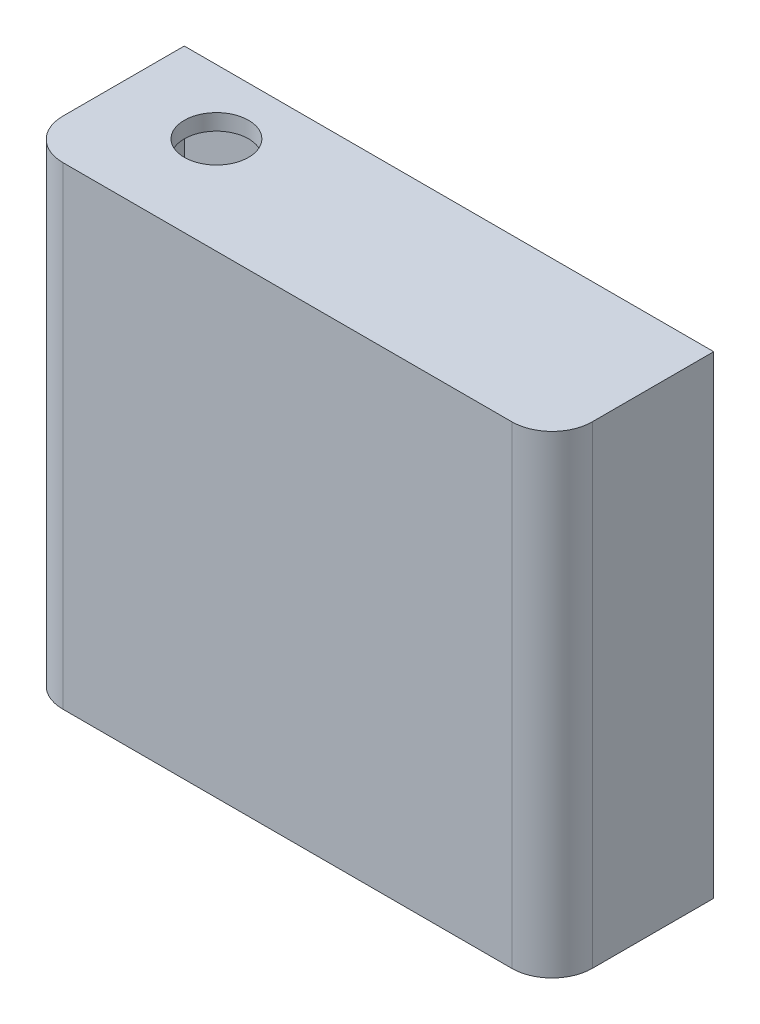
ISO-10303-21;
HEADER;
FILE_DESCRIPTION(('STEP AP214'),'2;1');
FILE_NAME('part.step','',(''),(''),'','','');
FILE_SCHEMA(('AUTOMOTIVE_DESIGN { 1 0 10303 214 1 1 1 1 }'));
ENDSEC;
DATA;
#1=APPLICATION_CONTEXT('core data for automotive mechanical design processes');
#2=APPLICATION_PROTOCOL_DEFINITION('international standard','automotive_design',2000,#1);
#3=PRODUCT_CONTEXT('',#1,'mechanical');
#4=PRODUCT('Part','Part','',(#3));
#5=PRODUCT_RELATED_PRODUCT_CATEGORY('part','',(#4));
#6=PRODUCT_DEFINITION_FORMATION('','',#4);
#7=PRODUCT_DEFINITION_CONTEXT('part definition',#1,'design');
#8=PRODUCT_DEFINITION('design','',#6,#7);
#9=PRODUCT_DEFINITION_SHAPE('','',#8);
#10=(LENGTH_UNIT() NAMED_UNIT(*) SI_UNIT(.MILLI.,.METRE.));
#11=(NAMED_UNIT(*) PLANE_ANGLE_UNIT() SI_UNIT($,.RADIAN.));
#12=(NAMED_UNIT(*) SI_UNIT($,.STERADIAN.) SOLID_ANGLE_UNIT());
#13=UNCERTAINTY_MEASURE_WITH_UNIT(LENGTH_MEASURE(1.E-05),#10,'distance_accuracy_value','');
#14=(GEOMETRIC_REPRESENTATION_CONTEXT(3) GLOBAL_UNCERTAINTY_ASSIGNED_CONTEXT((#13)) GLOBAL_UNIT_ASSIGNED_CONTEXT((#10,
#11,#12)) REPRESENTATION_CONTEXT('',''));
#15=CARTESIAN_POINT('',(0.,0.,0.));
#16=DIRECTION('',(0.,0.,1.));
#17=DIRECTION('',(1.,0.,0.));
#18=AXIS2_PLACEMENT_3D('',#15,#16,#17);
#19=CARTESIAN_POINT('',(0.,0.,-15.113));
#20=DIRECTION('',(0.,0.,-1.));
#21=DIRECTION('',(0.,1.,0.));
#22=AXIS2_PLACEMENT_3D('',#19,#20,#21);
#23=PLANE('',#22);
#24=DIRECTION('',(1.,0.,0.));
#25=VECTOR('',#24,1.);
#26=CARTESIAN_POINT('',(20.084,40.396,-15.113));
#27=LINE('',#26,#25);
#28=CARTESIAN_POINT('',(1.80000000000003,40.396,-15.113));
#29=VERTEX_POINT('',#28);
#30=CARTESIAN_POINT('',(24.084,40.396,-15.113));
#31=VERTEX_POINT('',#30);
#32=EDGE_CURVE('E238',#29,#31,#27,.T.);
#33=ORIENTED_EDGE('',*,*,#32,.T.);
#34=DIRECTION('',(0.,-1.,0.));
#35=VECTOR('',#34,1.);
#36=CARTESIAN_POINT('',(24.084,40.396,-15.113));
#37=LINE('',#36,#35);
#38=CARTESIAN_POINT('',(24.084,28.396,-15.113));
#39=VERTEX_POINT('',#38);
#40=EDGE_CURVE('E222',#31,#39,#37,.T.);
#41=ORIENTED_EDGE('',*,*,#40,.T.);
#42=DIRECTION('',(-1.,0.,0.));
#43=VECTOR('',#42,1.);
#44=CARTESIAN_POINT('',(20.084,28.396,-15.113));
#45=LINE('',#44,#43);
#46=CARTESIAN_POINT('',(1.80000000000003,28.396,-15.113));
#47=VERTEX_POINT('',#46);
#48=EDGE_CURVE('E230',#39,#47,#45,.T.);
#49=ORIENTED_EDGE('',*,*,#48,.T.);
#50=DIRECTION('',(0.,1.,0.));
#51=VECTOR('',#50,1.);
#52=CARTESIAN_POINT('',(1.80000000000003,40.396,-15.113));
#53=LINE('',#52,#51);
#54=EDGE_CURVE('E234',#47,#29,#53,.T.);
#55=ORIENTED_EDGE('',*,*,#54,.T.);
#56=EDGE_LOOP('',(#33,#41,#49,#55));
#57=FACE_BOUND('',#56,.T.);
#58=DIRECTION('',(0.,-1.,0.));
#59=VECTOR('',#58,1.);
#60=CARTESIAN_POINT('',(61.668,56.896,-15.113));
#61=LINE('',#60,#59);
#62=CARTESIAN_POINT('',(61.668,56.896,-15.113));
#63=VERTEX_POINT('',#62);
#64=CARTESIAN_POINT('',(61.668,0.,-15.113));
#65=VERTEX_POINT('',#64);
#66=EDGE_CURVE('E203',#63,#65,#61,.T.);
#67=ORIENTED_EDGE('',*,*,#66,.F.);
#68=DIRECTION('',(1.,0.,0.));
#69=VECTOR('',#68,1.);
#70=CARTESIAN_POINT('',(63.668,56.896,-15.113));
#71=LINE('',#70,#69);
#72=CARTESIAN_POINT('',(-0.199999999999965,56.896,-15.113));
#73=VERTEX_POINT('',#72);
#74=EDGE_CURVE('E274',#73,#63,#71,.T.);
#75=ORIENTED_EDGE('',*,*,#74,.F.);
#76=DIRECTION('',(0.,1.,0.));
#77=VECTOR('',#76,1.);
#78=CARTESIAN_POINT('',(-0.199999999999965,56.896,-15.113));
#79=LINE('',#78,#77);
#80=CARTESIAN_POINT('',(-0.199999999999964,0.,-15.113));
#81=VERTEX_POINT('',#80);
#82=EDGE_CURVE('E213',#81,#73,#79,.T.);
#83=ORIENTED_EDGE('',*,*,#82,.F.);
#84=DIRECTION('',(-1.,0.,0.));
#85=VECTOR('',#84,1.);
#86=CARTESIAN_POINT('',(63.668,0.,-15.113));
#87=LINE('',#86,#85);
#88=EDGE_CURVE('E270',#65,#81,#87,.T.);
#89=ORIENTED_EDGE('',*,*,#88,.F.);
#90=EDGE_LOOP('',(#67,#75,#83,#89));
#91=FACE_BOUND('',#90,.T.);
#92=ADVANCED_FACE('F39',(#57,#91),#23,.F.);
#93=CARTESIAN_POINT('',(63.668,56.896,-17.113));
#94=DIRECTION('',(-1.,0.,0.));
#95=DIRECTION('',(0.,-1.,0.));
#96=AXIS2_PLACEMENT_3D('',#93,#94,#95);
#97=PLANE('',#96);
#98=DIRECTION('',(0.,0.,-1.));
#99=VECTOR('',#98,1.);
#100=CARTESIAN_POINT('',(63.668,58.896,3.));
#101=LINE('',#100,#99);
#102=CARTESIAN_POINT('',(63.668,58.896,-2.));
#103=VERTEX_POINT('',#102);
#104=CARTESIAN_POINT('',(63.668,58.896,-17.113));
#105=VERTEX_POINT('',#104);
#106=EDGE_CURVE('E181',#103,#105,#101,.T.);
#107=ORIENTED_EDGE('',*,*,#106,.F.);
#108=DIRECTION('',(0.,1.,0.));
#109=VECTOR('',#108,1.);
#110=CARTESIAN_POINT('',(63.668,0.,-2.));
#111=LINE('',#110,#109);
#112=CARTESIAN_POINT('',(63.668,0.,-2.));
#113=VERTEX_POINT('',#112);
#114=EDGE_CURVE('E311',#103,#113,#111,.F.);
#115=ORIENTED_EDGE('',*,*,#114,.T.);
#116=DIRECTION('',(0.,0.,1.));
#117=VECTOR('',#116,1.);
#118=CARTESIAN_POINT('',(63.668,0.,-17.113));
#119=LINE('',#118,#117);
#120=CARTESIAN_POINT('',(63.668,0.,-17.113));
#121=VERTEX_POINT('',#120);
#122=EDGE_CURVE('E285',#121,#113,#119,.T.);
#123=ORIENTED_EDGE('',*,*,#122,.F.);
#124=DIRECTION('',(0.,-1.,0.));
#125=VECTOR('',#124,1.);
#126=CARTESIAN_POINT('',(63.668,56.896,-17.113));
#127=LINE('',#126,#125);
#128=EDGE_CURVE('E271',#105,#121,#127,.T.);
#129=ORIENTED_EDGE('',*,*,#128,.F.);
#130=EDGE_LOOP('',(#107,#115,#123,#129));
#131=FACE_BOUND('',#130,.T.);
#132=ADVANCED_FACE('F366',(#131),#97,.F.);
#133=CARTESIAN_POINT('',(63.668,0.,-17.113));
#134=DIRECTION('',(0.,1.,0.));
#135=DIRECTION('',(-1.,0.,0.));
#136=AXIS2_PLACEMENT_3D('',#133,#134,#135);
#137=PLANE('',#136);
#138=DIRECTION('',(0.,0.,-1.));
#139=VECTOR('',#138,1.);
#140=CARTESIAN_POINT('',(-0.199999999999958,0.,62.9311410038478));
#141=LINE('',#140,#139);
#142=CARTESIAN_POINT('',(-0.199999999999958,0.,-4.));
#143=VERTEX_POINT('',#142);
#144=EDGE_CURVE('E218',#143,#81,#141,.T.);
#145=ORIENTED_EDGE('',*,*,#144,.F.);
#146=CARTESIAN_POINT('',(4.80000000000004,0.,-4.));
#147=DIRECTION('',(0.,1.,0.));
#148=DIRECTION('',(-1.,0.,0.));
#149=AXIS2_PLACEMENT_3D('',#146,#147,#148);
#150=CIRCLE('',#149,5.);
#151=CARTESIAN_POINT('',(4.80000000000004,0.,0.999999999999999));
#152=VERTEX_POINT('',#151);
#153=EDGE_CURVE('E49',#143,#152,#150,.T.);
#154=ORIENTED_EDGE('',*,*,#153,.T.);
#155=DIRECTION('',(1.,0.,0.));
#156=VECTOR('',#155,1.);
#157=CARTESIAN_POINT('',(-2.19999999999997,0.,0.999999999999999));
#158=LINE('',#157,#156);
#159=CARTESIAN_POINT('',(56.668,0.,0.999999999999999));
#160=VERTEX_POINT('',#159);
#161=EDGE_CURVE('E195',#152,#160,#158,.T.);
#162=ORIENTED_EDGE('',*,*,#161,.T.);
#163=CARTESIAN_POINT('',(56.668,0.,-4.));
#164=DIRECTION('',(0.,1.,0.));
#165=DIRECTION('',(-1.,0.,0.));
#166=AXIS2_PLACEMENT_3D('',#163,#164,#165);
#167=CIRCLE('',#166,5.);
#168=CARTESIAN_POINT('',(61.668,0.,-4.));
#169=VERTEX_POINT('',#168);
#170=EDGE_CURVE('E11',#160,#169,#167,.T.);
#171=ORIENTED_EDGE('',*,*,#170,.T.);
#172=DIRECTION('',(0.,0.,-1.));
#173=VECTOR('',#172,1.);
#174=CARTESIAN_POINT('',(61.668,0.,62.9311410038478));
#175=LINE('',#174,#173);
#176=EDGE_CURVE('E207',#169,#65,#175,.T.);
#177=ORIENTED_EDGE('',*,*,#176,.T.);
#178=ORIENTED_EDGE('',*,*,#88,.T.);
#179=EDGE_LOOP('',(#145,#154,#162,#171,#177,#178));
#180=FACE_BOUND('',#179,.T.);
#181=DIRECTION('',(1.,0.,0.));
#182=VECTOR('',#181,1.);
#183=CARTESIAN_POINT('',(-2.19999999999996,0.,3.));
#184=LINE('',#183,#182);
#185=CARTESIAN_POINT('',(2.80000000000003,0.,3.));
#186=VERTEX_POINT('',#185);
#187=CARTESIAN_POINT('',(58.668,-2.94062861023119E-13,3.));
#188=VERTEX_POINT('',#187);
#189=EDGE_CURVE('E217',#186,#188,#184,.T.);
#190=ORIENTED_EDGE('',*,*,#189,.F.);
#191=CARTESIAN_POINT('',(2.80000000000003,0.,-2.));
#192=DIRECTION('',(0.,1.,0.));
#193=DIRECTION('',(-1.,0.,0.));
#194=AXIS2_PLACEMENT_3D('',#191,#192,#193);
#195=CIRCLE('',#194,5.);
#196=CARTESIAN_POINT('',(-2.19999999999997,0.,-2.));
#197=VERTEX_POINT('',#196);
#198=EDGE_CURVE('E300',#186,#197,#195,.F.);
#199=ORIENTED_EDGE('',*,*,#198,.T.);
#200=DIRECTION('',(0.,0.,1.));
#201=VECTOR('',#200,1.);
#202=CARTESIAN_POINT('',(-2.19999999999997,0.,-17.113));
#203=LINE('',#202,#201);
#204=CARTESIAN_POINT('',(-2.19999999999997,0.,-17.113));
#205=VERTEX_POINT('',#204);
#206=EDGE_CURVE('E167',#205,#197,#203,.T.);
#207=ORIENTED_EDGE('',*,*,#206,.F.);
#208=DIRECTION('',(-1.,0.,0.));
#209=VECTOR('',#208,1.);
#210=CARTESIAN_POINT('',(63.668,0.,-17.113));
#211=LINE('',#210,#209);
#212=EDGE_CURVE('E162',#121,#205,#211,.T.);
#213=ORIENTED_EDGE('',*,*,#212,.F.);
#214=ORIENTED_EDGE('',*,*,#122,.T.);
#215=CARTESIAN_POINT('',(58.668,0.,-2.));
#216=DIRECTION('',(0.,1.,0.));
#217=DIRECTION('',(-1.,0.,0.));
#218=AXIS2_PLACEMENT_3D('',#215,#216,#217);
#219=CIRCLE('',#218,5.);
#220=EDGE_CURVE('E297',#113,#188,#219,.F.);
#221=ORIENTED_EDGE('',*,*,#220,.T.);
#222=EDGE_LOOP('',(#190,#199,#207,#213,#214,#221));
#223=FACE_BOUND('',#222,.T.);
#224=ADVANCED_FACE('F334',(#180,#223),#137,.F.);
#225=CARTESIAN_POINT('',(-2.19999999999997,56.896,-17.113));
#226=DIRECTION('',(1.,0.,0.));
#227=DIRECTION('',(0.,0.,-1.));
#228=AXIS2_PLACEMENT_3D('',#225,#226,#227);
#229=PLANE('',#228);
#230=ORIENTED_EDGE('',*,*,#206,.T.);
#231=DIRECTION('',(0.,-1.,0.));
#232=VECTOR('',#231,1.);
#233=CARTESIAN_POINT('',(-2.19999999999997,58.896,-2.));
#234=LINE('',#233,#232);
#235=CARTESIAN_POINT('',(-2.19999999999997,58.896,-2.));
#236=VERTEX_POINT('',#235);
#237=EDGE_CURVE('E173',#197,#236,#234,.F.);
#238=ORIENTED_EDGE('',*,*,#237,.T.);
#239=DIRECTION('',(0.,0.,1.));
#240=VECTOR('',#239,1.);
#241=CARTESIAN_POINT('',(-2.19999999999997,58.896,-17.113));
#242=LINE('',#241,#240);
#243=CARTESIAN_POINT('',(-2.19999999999997,58.896,-17.113));
#244=VERTEX_POINT('',#243);
#245=EDGE_CURVE('E170',#244,#236,#242,.T.);
#246=ORIENTED_EDGE('',*,*,#245,.F.);
#247=DIRECTION('',(0.,1.,0.));
#248=VECTOR('',#247,1.);
#249=CARTESIAN_POINT('',(-2.19999999999997,56.896,-17.113));
#250=LINE('',#249,#248);
#251=EDGE_CURVE('E156',#205,#244,#250,.T.);
#252=ORIENTED_EDGE('',*,*,#251,.F.);
#253=EDGE_LOOP('',(#230,#238,#246,#252));
#254=FACE_BOUND('',#253,.T.);
#255=ADVANCED_FACE('F171',(#254),#229,.F.);
#256=CARTESIAN_POINT('',(0.,0.,-17.113));
#257=DIRECTION('',(0.,0.,-1.));
#258=DIRECTION('',(0.,1.,0.));
#259=AXIS2_PLACEMENT_3D('',#256,#257,#258);
#260=PLANE('',#259);
#261=DIRECTION('',(0.,-1.,0.));
#262=VECTOR('',#261,1.);
#263=CARTESIAN_POINT('',(24.084,0.,-17.113));
#264=LINE('',#263,#262);
#265=CARTESIAN_POINT('',(24.084,40.396,-17.113));
#266=VERTEX_POINT('',#265);
#267=CARTESIAN_POINT('',(24.084,28.396,-17.113));
#268=VERTEX_POINT('',#267);
#269=EDGE_CURVE('E266',#266,#268,#264,.T.);
#270=ORIENTED_EDGE('',*,*,#269,.F.);
#271=DIRECTION('',(1.,0.,0.));
#272=VECTOR('',#271,1.);
#273=CARTESIAN_POINT('',(0.,40.396,-17.113));
#274=LINE('',#273,#272);
#275=CARTESIAN_POINT('',(1.80000000000003,40.396,-17.113));
#276=VERTEX_POINT('',#275);
#277=EDGE_CURVE('E263',#276,#266,#274,.T.);
#278=ORIENTED_EDGE('',*,*,#277,.F.);
#279=DIRECTION('',(0.,1.,0.));
#280=VECTOR('',#279,1.);
#281=CARTESIAN_POINT('',(1.80000000000003,0.,-17.113));
#282=LINE('',#281,#280);
#283=CARTESIAN_POINT('',(1.80000000000003,28.396,-17.113));
#284=VERTEX_POINT('',#283);
#285=EDGE_CURVE('E260',#284,#276,#282,.T.);
#286=ORIENTED_EDGE('',*,*,#285,.F.);
#287=DIRECTION('',(-1.,0.,0.));
#288=VECTOR('',#287,1.);
#289=CARTESIAN_POINT('',(0.,28.396,-17.113));
#290=LINE('',#289,#288);
#291=EDGE_CURVE('E247',#268,#284,#290,.T.);
#292=ORIENTED_EDGE('',*,*,#291,.F.);
#293=EDGE_LOOP('',(#270,#278,#286,#292));
#294=FACE_BOUND('',#293,.T.);
#295=ORIENTED_EDGE('',*,*,#128,.T.);
#296=ORIENTED_EDGE('',*,*,#212,.T.);
#297=ORIENTED_EDGE('',*,*,#251,.T.);
#298=DIRECTION('',(-1.,0.,0.));
#299=VECTOR('',#298,1.);
#300=CARTESIAN_POINT('',(63.668,58.896,-17.113));
#301=LINE('',#300,#299);
#302=EDGE_CURVE('E161',#105,#244,#301,.T.);
#303=ORIENTED_EDGE('',*,*,#302,.F.);
#304=EDGE_LOOP('',(#295,#296,#297,#303));
#305=FACE_BOUND('',#304,.T.);
#306=ADVANCED_FACE('F159',(#294,#305),#260,.T.);
#307=CARTESIAN_POINT('',(24.084,40.396,-15.113));
#308=DIRECTION('',(1.,0.,0.));
#309=DIRECTION('',(0.,0.,-1.));
#310=AXIS2_PLACEMENT_3D('',#307,#308,#309);
#311=PLANE('',#310);
#312=ORIENTED_EDGE('',*,*,#269,.T.);
#313=DIRECTION('',(0.,0.,-1.));
#314=VECTOR('',#313,1.);
#315=CARTESIAN_POINT('',(24.084,28.396,-15.113));
#316=LINE('',#315,#314);
#317=EDGE_CURVE('E242',#39,#268,#316,.T.);
#318=ORIENTED_EDGE('',*,*,#317,.F.);
#319=ORIENTED_EDGE('',*,*,#40,.F.);
#320=DIRECTION('',(0.,0.,-1.));
#321=VECTOR('',#320,1.);
#322=CARTESIAN_POINT('',(24.084,40.396,-15.113));
#323=LINE('',#322,#321);
#324=EDGE_CURVE('E243',#31,#266,#323,.T.);
#325=ORIENTED_EDGE('',*,*,#324,.T.);
#326=EDGE_LOOP('',(#312,#318,#319,#325));
#327=FACE_BOUND('',#326,.T.);
#328=ADVANCED_FACE('F416',(#327),#311,.F.);
#329=CARTESIAN_POINT('',(20.084,40.396,-15.113));
#330=DIRECTION('',(0.,1.,0.));
#331=DIRECTION('',(0.,0.,1.));
#332=AXIS2_PLACEMENT_3D('',#329,#330,#331);
#333=PLANE('',#332);
#334=ORIENTED_EDGE('',*,*,#277,.T.);
#335=ORIENTED_EDGE('',*,*,#324,.F.);
#336=ORIENTED_EDGE('',*,*,#32,.F.);
#337=DIRECTION('',(0.,0.,-1.));
#338=VECTOR('',#337,1.);
#339=CARTESIAN_POINT('',(1.80000000000003,40.396,-15.113));
#340=LINE('',#339,#338);
#341=EDGE_CURVE('E248',#29,#276,#340,.T.);
#342=ORIENTED_EDGE('',*,*,#341,.T.);
#343=EDGE_LOOP('',(#334,#335,#336,#342));
#344=FACE_BOUND('',#343,.T.);
#345=ADVANCED_FACE('F412',(#344),#333,.F.);
#346=CARTESIAN_POINT('',(1.80000000000003,40.396,-15.113));
#347=DIRECTION('',(-1.,0.,0.));
#348=DIRECTION('',(0.,-1.,0.));
#349=AXIS2_PLACEMENT_3D('',#346,#347,#348);
#350=PLANE('',#349);
#351=ORIENTED_EDGE('',*,*,#285,.T.);
#352=ORIENTED_EDGE('',*,*,#341,.F.);
#353=ORIENTED_EDGE('',*,*,#54,.F.);
#354=DIRECTION('',(0.,0.,-1.));
#355=VECTOR('',#354,1.);
#356=CARTESIAN_POINT('',(1.80000000000003,28.396,-15.113));
#357=LINE('',#356,#355);
#358=EDGE_CURVE('E252',#47,#284,#357,.T.);
#359=ORIENTED_EDGE('',*,*,#358,.T.);
#360=EDGE_LOOP('',(#351,#352,#353,#359));
#361=FACE_BOUND('',#360,.T.);
#362=ADVANCED_FACE('F415',(#361),#350,.F.);
#363=CARTESIAN_POINT('',(1.80000000000003,28.396,-15.113));
#364=DIRECTION('',(0.,-1.,0.));
#365=DIRECTION('',(0.,0.,-1.));
#366=AXIS2_PLACEMENT_3D('',#363,#364,#365);
#367=PLANE('',#366);
#368=ORIENTED_EDGE('',*,*,#291,.T.);
#369=ORIENTED_EDGE('',*,*,#358,.F.);
#370=ORIENTED_EDGE('',*,*,#48,.F.);
#371=ORIENTED_EDGE('',*,*,#317,.T.);
#372=EDGE_LOOP('',(#368,#369,#370,#371));
#373=FACE_BOUND('',#372,.T.);
#374=ADVANCED_FACE('F409',(#373),#367,.F.);
#375=CARTESIAN_POINT('',(-0.199999999999965,56.896,62.9311410038478));
#376=DIRECTION('',(-1.,0.,0.));
#377=DIRECTION('',(0.,-1.,0.));
#378=AXIS2_PLACEMENT_3D('',#375,#376,#377);
#379=PLANE('',#378);
#380=DIRECTION('',(0.,0.,-1.));
#381=VECTOR('',#380,1.);
#382=CARTESIAN_POINT('',(-0.199999999999965,56.896,62.9311410038478));
#383=LINE('',#382,#381);
#384=CARTESIAN_POINT('',(-0.199999999999965,56.896,-4.));
#385=VERTEX_POINT('',#384);
#386=EDGE_CURVE('E212',#385,#73,#383,.T.);
#387=ORIENTED_EDGE('',*,*,#386,.F.);
#388=DIRECTION('',(0.,-1.,0.));
#389=VECTOR('',#388,1.);
#390=CARTESIAN_POINT('',(-0.199999999999965,56.896,-4.));
#391=LINE('',#390,#389);
#392=EDGE_CURVE('E314',#385,#143,#391,.T.);
#393=ORIENTED_EDGE('',*,*,#392,.T.);
#394=ORIENTED_EDGE('',*,*,#144,.T.);
#395=ORIENTED_EDGE('',*,*,#82,.T.);
#396=EDGE_LOOP('',(#387,#393,#394,#395));
#397=FACE_BOUND('',#396,.T.);
#398=ADVANCED_FACE('F347',(#397),#379,.F.);
#399=CARTESIAN_POINT('',(0.,56.896,3.));
#400=DIRECTION('',(0.,0.,1.));
#401=DIRECTION('',(0.,-1.,0.));
#402=AXIS2_PLACEMENT_3D('',#399,#400,#401);
#403=PLANE('',#402);
#404=DIRECTION('',(1.,0.,0.));
#405=VECTOR('',#404,1.);
#406=CARTESIAN_POINT('',(-2.19999999999997,58.896,3.));
#407=LINE('',#406,#405);
#408=CARTESIAN_POINT('',(2.80000000000003,58.896,3.));
#409=VERTEX_POINT('',#408);
#410=CARTESIAN_POINT('',(58.668,58.896,3.));
#411=VERTEX_POINT('',#410);
#412=EDGE_CURVE('E177',#409,#411,#407,.T.);
#413=ORIENTED_EDGE('',*,*,#412,.F.);
#414=DIRECTION('',(0.,-1.,0.));
#415=VECTOR('',#414,1.);
#416=CARTESIAN_POINT('',(2.80000000000003,0.,3.));
#417=LINE('',#416,#415);
#418=EDGE_CURVE('E293',#409,#186,#417,.T.);
#419=ORIENTED_EDGE('',*,*,#418,.T.);
#420=ORIENTED_EDGE('',*,*,#189,.T.);
#421=DIRECTION('',(0.,1.,0.));
#422=VECTOR('',#421,1.);
#423=CARTESIAN_POINT('',(58.668,58.896,3.));
#424=LINE('',#423,#422);
#425=EDGE_CURVE('E289',#188,#411,#424,.T.);
#426=ORIENTED_EDGE('',*,*,#425,.T.);
#427=EDGE_LOOP('',(#413,#419,#420,#426));
#428=FACE_BOUND('',#427,.T.);
#429=ADVANCED_FACE('F398',(#428),#403,.T.);
#430=CARTESIAN_POINT('',(61.668,56.896,62.9311410038478));
#431=DIRECTION('',(1.,0.,0.));
#432=DIRECTION('',(0.,1.,0.));
#433=AXIS2_PLACEMENT_3D('',#430,#431,#432);
#434=PLANE('',#433);
#435=ORIENTED_EDGE('',*,*,#176,.F.);
#436=DIRECTION('',(0.,1.,0.));
#437=VECTOR('',#436,1.);
#438=CARTESIAN_POINT('',(61.668,56.896,-4.));
#439=LINE('',#438,#437);
#440=CARTESIAN_POINT('',(61.668,56.896,-4.));
#441=VERTEX_POINT('',#440);
#442=EDGE_CURVE('E328',#169,#441,#439,.T.);
#443=ORIENTED_EDGE('',*,*,#442,.T.);
#444=DIRECTION('',(0.,0.,-1.));
#445=VECTOR('',#444,1.);
#446=CARTESIAN_POINT('',(61.668,56.896,62.9311410038478));
#447=LINE('',#446,#445);
#448=EDGE_CURVE('E202',#441,#63,#447,.T.);
#449=ORIENTED_EDGE('',*,*,#448,.T.);
#450=ORIENTED_EDGE('',*,*,#66,.T.);
#451=EDGE_LOOP('',(#435,#443,#449,#450));
#452=FACE_BOUND('',#451,.T.);
#453=ADVANCED_FACE('F355',(#452),#434,.F.);
#454=CARTESIAN_POINT('',(0.,0.,0.999999999999999));
#455=DIRECTION('',(0.,0.,-1.));
#456=DIRECTION('',(-1.,0.,0.));
#457=AXIS2_PLACEMENT_3D('',#454,#455,#456);
#458=PLANE('',#457);
#459=ORIENTED_EDGE('',*,*,#161,.F.);
#460=DIRECTION('',(0.,-1.,0.));
#461=VECTOR('',#460,1.);
#462=CARTESIAN_POINT('',(4.80000000000004,0.,0.999999999999999));
#463=LINE('',#462,#461);
#464=CARTESIAN_POINT('',(4.80000000000003,56.896,0.999999999999999));
#465=VERTEX_POINT('',#464);
#466=EDGE_CURVE('E64',#152,#465,#463,.F.);
#467=ORIENTED_EDGE('',*,*,#466,.T.);
#468=DIRECTION('',(-1.,0.,0.));
#469=VECTOR('',#468,1.);
#470=CARTESIAN_POINT('',(-2.19999999999997,56.896,0.999999999999999));
#471=LINE('',#470,#469);
#472=CARTESIAN_POINT('',(56.668,56.896,0.999999999999999));
#473=VERTEX_POINT('',#472);
#474=EDGE_CURVE('E199',#473,#465,#471,.T.);
#475=ORIENTED_EDGE('',*,*,#474,.F.);
#476=DIRECTION('',(0.,1.,0.));
#477=VECTOR('',#476,1.);
#478=CARTESIAN_POINT('',(56.668,0.,0.999999999999999));
#479=LINE('',#478,#477);
#480=EDGE_CURVE('E318',#473,#160,#479,.F.);
#481=ORIENTED_EDGE('',*,*,#480,.T.);
#482=EDGE_LOOP('',(#459,#467,#475,#481));
#483=FACE_BOUND('',#482,.T.);
#484=ADVANCED_FACE('F339',(#483),#458,.T.);
#485=CARTESIAN_POINT('',(0.,56.896,0.));
#486=DIRECTION('',(0.,1.,0.));
#487=DIRECTION('',(-1.,0.,0.));
#488=AXIS2_PLACEMENT_3D('',#485,#486,#487);
#489=PLANE('',#488);
#490=CARTESIAN_POINT('',(9.80000000000003,56.896,-9.113));
#491=DIRECTION('',(0.,1.,0.));
#492=DIRECTION('',(-1.,0.,0.));
#493=AXIS2_PLACEMENT_3D('',#490,#491,#492);
#494=CIRCLE('',#493,4.);
#495=CARTESIAN_POINT('',(5.80000000000003,56.896,-9.113));
#496=VERTEX_POINT('',#495);
#497=EDGE_CURVE('E184',#496,#496,#494,.T.);
#498=ORIENTED_EDGE('',*,*,#497,.T.);
#499=EDGE_LOOP('',(#498));
#500=FACE_BOUND('',#499,.T.);
#501=ORIENTED_EDGE('',*,*,#474,.T.);
#502=CARTESIAN_POINT('',(4.80000000000003,56.896,-4.));
#503=DIRECTION('',(0.,1.,0.));
#504=DIRECTION('',(-1.,0.,0.));
#505=AXIS2_PLACEMENT_3D('',#502,#503,#504);
#506=CIRCLE('',#505,5.);
#507=EDGE_CURVE('E325',#465,#385,#506,.F.);
#508=ORIENTED_EDGE('',*,*,#507,.T.);
#509=ORIENTED_EDGE('',*,*,#386,.T.);
#510=ORIENTED_EDGE('',*,*,#74,.T.);
#511=ORIENTED_EDGE('',*,*,#448,.F.);
#512=CARTESIAN_POINT('',(56.668,56.896,-4.));
#513=DIRECTION('',(0.,1.,0.));
#514=DIRECTION('',(-1.,0.,0.));
#515=AXIS2_PLACEMENT_3D('',#512,#513,#514);
#516=CIRCLE('',#515,5.);
#517=EDGE_CURVE('E56',#441,#473,#516,.F.);
#518=ORIENTED_EDGE('',*,*,#517,.T.);
#519=EDGE_LOOP('',(#501,#508,#509,#510,#511,#518));
#520=FACE_BOUND('',#519,.T.);
#521=ADVANCED_FACE('F344',(#500,#520),#489,.F.);
#522=CARTESIAN_POINT('',(0.,58.896,0.));
#523=DIRECTION('',(0.,1.,0.));
#524=DIRECTION('',(-1.,0.,0.));
#525=AXIS2_PLACEMENT_3D('',#522,#523,#524);
#526=PLANE('',#525);
#527=CARTESIAN_POINT('',(9.80000000000003,58.896,-9.113));
#528=DIRECTION('',(0.,1.,0.));
#529=DIRECTION('',(-1.,0.,0.));
#530=AXIS2_PLACEMENT_3D('',#527,#528,#529);
#531=CIRCLE('',#530,4.);
#532=CARTESIAN_POINT('',(5.80000000000003,58.896,-9.113));
#533=VERTEX_POINT('',#532);
#534=EDGE_CURVE('E43',#533,#533,#531,.T.);
#535=ORIENTED_EDGE('',*,*,#534,.F.);
#536=EDGE_LOOP('',(#535));
#537=FACE_BOUND('',#536,.T.);
#538=ORIENTED_EDGE('',*,*,#245,.T.);
#539=CARTESIAN_POINT('',(2.80000000000003,58.896,-2.));
#540=DIRECTION('',(0.,1.,0.));
#541=DIRECTION('',(-1.,0.,0.));
#542=AXIS2_PLACEMENT_3D('',#539,#540,#541);
#543=CIRCLE('',#542,5.);
#544=EDGE_CURVE('E308',#236,#409,#543,.T.);
#545=ORIENTED_EDGE('',*,*,#544,.T.);
#546=ORIENTED_EDGE('',*,*,#412,.T.);
#547=CARTESIAN_POINT('',(58.668,58.896,-2.));
#548=DIRECTION('',(0.,1.,0.));
#549=DIRECTION('',(-1.,0.,0.));
#550=AXIS2_PLACEMENT_3D('',#547,#548,#549);
#551=CIRCLE('',#550,5.);
#552=EDGE_CURVE('E305',#411,#103,#551,.T.);
#553=ORIENTED_EDGE('',*,*,#552,.T.);
#554=ORIENTED_EDGE('',*,*,#106,.T.);
#555=ORIENTED_EDGE('',*,*,#302,.T.);
#556=EDGE_LOOP('',(#538,#545,#546,#553,#554,#555));
#557=FACE_BOUND('',#556,.T.);
#558=ADVANCED_FACE('F179',(#537,#557),#526,.T.);
#559=CARTESIAN_POINT('',(2.80000000000003,56.896,-2.));
#560=DIRECTION('',(0.,1.,0.));
#561=DIRECTION('',(0.,0.,1.));
#562=AXIS2_PLACEMENT_3D('',#559,#560,#561);
#563=CYLINDRICAL_SURFACE('',#562,5.);
#564=ORIENTED_EDGE('',*,*,#544,.F.);
#565=ORIENTED_EDGE('',*,*,#237,.F.);
#566=ORIENTED_EDGE('',*,*,#198,.F.);
#567=ORIENTED_EDGE('',*,*,#418,.F.);
#568=EDGE_LOOP('',(#564,#565,#566,#567));
#569=FACE_BOUND('',#568,.T.);
#570=ADVANCED_FACE('F383',(#569),#563,.T.);
#571=CARTESIAN_POINT('',(58.668,56.896,-2.));
#572=DIRECTION('',(0.,-1.,0.));
#573=DIRECTION('',(1.,0.,0.));
#574=AXIS2_PLACEMENT_3D('',#571,#572,#573);
#575=CYLINDRICAL_SURFACE('',#574,5.);
#576=ORIENTED_EDGE('',*,*,#220,.F.);
#577=ORIENTED_EDGE('',*,*,#114,.F.);
#578=ORIENTED_EDGE('',*,*,#552,.F.);
#579=ORIENTED_EDGE('',*,*,#425,.F.);
#580=EDGE_LOOP('',(#576,#577,#578,#579));
#581=FACE_BOUND('',#580,.T.);
#582=ADVANCED_FACE('F364',(#581),#575,.T.);
#583=CARTESIAN_POINT('',(4.80000000000003,56.896,-4.));
#584=DIRECTION('',(0.,-1.,0.));
#585=DIRECTION('',(1.,0.,0.));
#586=AXIS2_PLACEMENT_3D('',#583,#584,#585);
#587=CYLINDRICAL_SURFACE('',#586,5.);
#588=ORIENTED_EDGE('',*,*,#507,.F.);
#589=ORIENTED_EDGE('',*,*,#466,.F.);
#590=ORIENTED_EDGE('',*,*,#153,.F.);
#591=ORIENTED_EDGE('',*,*,#392,.F.);
#592=EDGE_LOOP('',(#588,#589,#590,#591));
#593=FACE_BOUND('',#592,.T.);
#594=ADVANCED_FACE('F341',(#593),#587,.F.);
#595=CARTESIAN_POINT('',(56.668,56.896,-4.));
#596=DIRECTION('',(0.,1.,0.));
#597=DIRECTION('',(-1.,0.,0.));
#598=AXIS2_PLACEMENT_3D('',#595,#596,#597);
#599=CYLINDRICAL_SURFACE('',#598,5.);
#600=ORIENTED_EDGE('',*,*,#170,.F.);
#601=ORIENTED_EDGE('',*,*,#480,.F.);
#602=ORIENTED_EDGE('',*,*,#517,.F.);
#603=ORIENTED_EDGE('',*,*,#442,.F.);
#604=EDGE_LOOP('',(#600,#601,#602,#603));
#605=FACE_BOUND('',#604,.T.);
#606=ADVANCED_FACE('F41',(#605),#599,.F.);
#607=CARTESIAN_POINT('',(9.80000000000002,-2.91433543964104E-13,-9.113));
#608=DIRECTION('',(0.,1.,0.));
#609=DIRECTION('',(-1.,0.,0.));
#610=AXIS2_PLACEMENT_3D('',#607,#608,#609);
#611=CYLINDRICAL_SURFACE('',#610,4.);
#612=CARTESIAN_POINT('',(5.80000000000003,58.896,-9.113));
#613=CARTESIAN_POINT('',(5.80000000000003,58.8751666666667,-9.113));
#614=CARTESIAN_POINT('',(5.80000000000003,58.8543333333333,-9.113));
#615=CARTESIAN_POINT('',(5.80000000000003,58.8126666666667,-9.113));
#616=CARTESIAN_POINT('',(5.80000000000003,58.7918333333333,-9.113));
#617=CARTESIAN_POINT('',(5.80000000000003,58.7501666666667,-9.113));
#618=CARTESIAN_POINT('',(5.80000000000003,58.7293333333333,-9.113));
#619=CARTESIAN_POINT('',(5.80000000000003,58.6876666666667,-9.113));
#620=CARTESIAN_POINT('',(5.80000000000003,58.6668333333333,-9.113));
#621=CARTESIAN_POINT('',(5.80000000000003,58.6251666666667,-9.113));
#622=CARTESIAN_POINT('',(5.80000000000003,58.6043333333333,-9.113));
#623=CARTESIAN_POINT('',(5.80000000000003,58.5626666666667,-9.113));
#624=CARTESIAN_POINT('',(5.80000000000003,58.5418333333333,-9.113));
#625=CARTESIAN_POINT('',(5.80000000000003,58.5001666666667,-9.113));
#626=CARTESIAN_POINT('',(5.80000000000003,58.4793333333333,-9.113));
#627=CARTESIAN_POINT('',(5.80000000000003,58.4376666666667,-9.113));
#628=CARTESIAN_POINT('',(5.80000000000003,58.4168333333333,-9.113));
#629=CARTESIAN_POINT('',(5.80000000000003,58.3751666666667,-9.113));
#630=CARTESIAN_POINT('',(5.80000000000003,58.3543333333333,-9.113));
#631=CARTESIAN_POINT('',(5.80000000000003,58.3126666666667,-9.113));
#632=CARTESIAN_POINT('',(5.80000000000003,58.2918333333333,-9.113));
#633=CARTESIAN_POINT('',(5.80000000000003,58.2501666666667,-9.113));
#634=CARTESIAN_POINT('',(5.80000000000003,58.2293333333333,-9.113));
#635=CARTESIAN_POINT('',(5.80000000000003,58.1876666666667,-9.113));
#636=CARTESIAN_POINT('',(5.80000000000003,58.1668333333333,-9.113));
#637=CARTESIAN_POINT('',(5.80000000000003,58.1251666666667,-9.113));
#638=CARTESIAN_POINT('',(5.80000000000003,58.1043333333333,-9.113));
#639=CARTESIAN_POINT('',(5.80000000000003,58.0626666666667,-9.113));
#640=CARTESIAN_POINT('',(5.80000000000003,58.0418333333333,-9.113));
#641=CARTESIAN_POINT('',(5.80000000000003,58.0001666666667,-9.113));
#642=CARTESIAN_POINT('',(5.80000000000003,57.9793333333333,-9.113));
#643=CARTESIAN_POINT('',(5.80000000000003,57.9376666666667,-9.113));
#644=CARTESIAN_POINT('',(5.80000000000003,57.9168333333333,-9.113));
#645=CARTESIAN_POINT('',(5.80000000000003,57.8751666666667,-9.113));
#646=CARTESIAN_POINT('',(5.80000000000003,57.8543333333333,-9.113));
#647=CARTESIAN_POINT('',(5.80000000000003,57.8126666666667,-9.113));
#648=CARTESIAN_POINT('',(5.80000000000003,57.7918333333333,-9.113));
#649=CARTESIAN_POINT('',(5.80000000000003,57.7501666666667,-9.113));
#650=CARTESIAN_POINT('',(5.80000000000003,57.7293333333333,-9.113));
#651=CARTESIAN_POINT('',(5.80000000000003,57.6876666666667,-9.113));
#652=CARTESIAN_POINT('',(5.80000000000003,57.6668333333333,-9.113));
#653=CARTESIAN_POINT('',(5.80000000000003,57.6251666666667,-9.113));
#654=CARTESIAN_POINT('',(5.80000000000003,57.6043333333333,-9.113));
#655=CARTESIAN_POINT('',(5.80000000000003,57.5626666666667,-9.113));
#656=CARTESIAN_POINT('',(5.80000000000003,57.5418333333333,-9.113));
#657=CARTESIAN_POINT('',(5.80000000000003,57.5001666666667,-9.113));
#658=CARTESIAN_POINT('',(5.80000000000003,57.4793333333333,-9.113));
#659=CARTESIAN_POINT('',(5.80000000000003,57.4376666666667,-9.113));
#660=CARTESIAN_POINT('',(5.80000000000003,57.4168333333333,-9.113));
#661=CARTESIAN_POINT('',(5.80000000000003,57.3751666666667,-9.113));
#662=CARTESIAN_POINT('',(5.80000000000003,57.3543333333333,-9.113));
#663=CARTESIAN_POINT('',(5.80000000000003,57.3126666666667,-9.113));
#664=CARTESIAN_POINT('',(5.80000000000003,57.2918333333333,-9.113));
#665=CARTESIAN_POINT('',(5.80000000000003,57.2501666666667,-9.113));
#666=CARTESIAN_POINT('',(5.80000000000003,57.2293333333333,-9.113));
#667=CARTESIAN_POINT('',(5.80000000000003,57.1876666666667,-9.113));
#668=CARTESIAN_POINT('',(5.80000000000003,57.1668333333333,-9.113));
#669=CARTESIAN_POINT('',(5.80000000000003,57.1251666666667,-9.113));
#670=CARTESIAN_POINT('',(5.80000000000003,57.1043333333333,-9.113));
#671=CARTESIAN_POINT('',(5.80000000000003,57.0626666666667,-9.113));
#672=CARTESIAN_POINT('',(5.80000000000003,57.0418333333333,-9.113));
#673=CARTESIAN_POINT('',(5.80000000000003,57.0001666666667,-9.113));
#674=CARTESIAN_POINT('',(5.80000000000003,56.9793333333333,-9.113));
#675=CARTESIAN_POINT('',(5.80000000000003,56.9376666666667,-9.113));
#676=CARTESIAN_POINT('',(5.80000000000003,56.9168333333333,-9.113));
#677=CARTESIAN_POINT('',(5.80000000000003,56.896,-9.113));
#678=B_SPLINE_CURVE_WITH_KNOTS('',3,(#612,#613,#614,#615,#616,#617,#618,#619,#620,#621,#622,
#623,#624,#625,#626,#627,#628,#629,#630,#631,#632,#633,#634,#635,#636,#637,#638,#639,#640,#641,
#642,#643,#644,#645,#646,#647,#648,#649,#650,#651,#652,#653,#654,#655,#656,#657,#658,#659,#660,
#661,#662,#663,#664,#665,#666,#667,#668,#669,#670,#671,#672,#673,#674,#675,#676,#677),
.UNSPECIFIED.,.F.,.F.,(4,2,2,2,2,2,2,2,2,2,2,2,2,2,2,2,2,2,2,2,2,2,2,2,2,2,2,2,2,2,2,2,4),(0.,
0.0625000000000001,0.125,0.1875,0.25,0.3125,0.375,0.4375,0.5,0.5625,0.625000000000001,
0.687500000000001,0.750000000000001,0.812500000000001,0.875000000000001,0.937500000000001,1.,
1.0625,1.125,1.1875,1.25,1.3125,1.375,1.4375,1.5,1.5625,1.625,1.6875,1.75,1.8125,1.875,1.9375,
2.),.UNSPECIFIED.);
#679=EDGE_CURVE('BSEAM357',#533,#496,#678,.T.);
#680=ORIENTED_EDGE('',*,*,#534,.T.);
#681=ORIENTED_EDGE('',*,*,#497,.F.);
#682=ORIENTED_EDGE('',*,*,#679,.T.);
#683=ORIENTED_EDGE('',*,*,#679,.F.);
#684=EDGE_LOOP('',(#680,#682,#681,#683));
#685=FACE_BOUND('',#684,.T.);
#686=ADVANCED_FACE('F357',(#685),#611,.F.);
#687=CLOSED_SHELL('',(#92,#132,#224,#255,#306,#328,#345,#362,#374,#398,#429,#453,#484,#521,#558,
#570,#582,#594,#606,#686));
#688=MANIFOLD_SOLID_BREP('B2',#687);
#689=ADVANCED_BREP_SHAPE_REPRESENTATION('',(#18,#688),#14);
#690=SHAPE_DEFINITION_REPRESENTATION(#9,#689);
ENDSEC;
END-ISO-10303-21;
